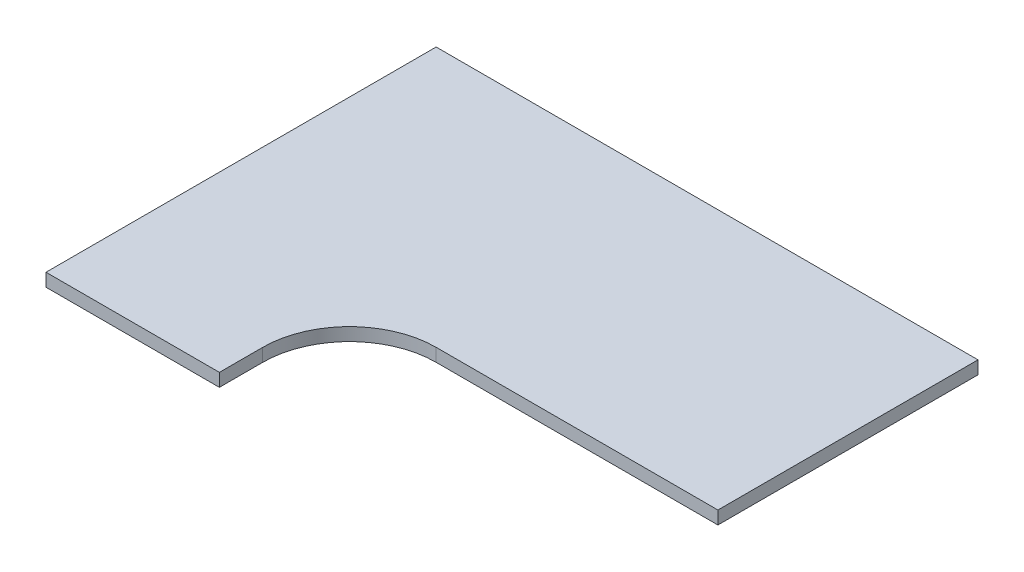
ISO-10303-21;
HEADER;
FILE_DESCRIPTION(('STEP AP214'),'2;1');
FILE_NAME('part.step','',(''),(''),'','','');
FILE_SCHEMA(('AUTOMOTIVE_DESIGN { 1 0 10303 214 1 1 1 1 }'));
ENDSEC;
DATA;
#1=APPLICATION_CONTEXT('core data for automotive mechanical design processes');
#2=APPLICATION_PROTOCOL_DEFINITION('international standard','automotive_design',2000,#1);
#3=PRODUCT_CONTEXT('',#1,'mechanical');
#4=PRODUCT('Part','Part','',(#3));
#5=PRODUCT_RELATED_PRODUCT_CATEGORY('part','',(#4));
#6=PRODUCT_DEFINITION_FORMATION('','',#4);
#7=PRODUCT_DEFINITION_CONTEXT('part definition',#1,'design');
#8=PRODUCT_DEFINITION('design','',#6,#7);
#9=PRODUCT_DEFINITION_SHAPE('','',#8);
#10=(LENGTH_UNIT() NAMED_UNIT(*) SI_UNIT(.MILLI.,.METRE.));
#11=(NAMED_UNIT(*) PLANE_ANGLE_UNIT() SI_UNIT($,.RADIAN.));
#12=(NAMED_UNIT(*) SI_UNIT($,.STERADIAN.) SOLID_ANGLE_UNIT());
#13=UNCERTAINTY_MEASURE_WITH_UNIT(LENGTH_MEASURE(1.E-05),#10,'distance_accuracy_value','');
#14=(GEOMETRIC_REPRESENTATION_CONTEXT(3) GLOBAL_UNCERTAINTY_ASSIGNED_CONTEXT((#13)) GLOBAL_UNIT_ASSIGNED_CONTEXT((#10,
#11,#12)) REPRESENTATION_CONTEXT('',''));
#15=CARTESIAN_POINT('',(0.,0.,0.));
#16=DIRECTION('',(0.,0.,1.));
#17=DIRECTION('',(1.,0.,0.));
#18=AXIS2_PLACEMENT_3D('',#15,#16,#17);
#19=CARTESIAN_POINT('',(0.,30.,0.));
#20=DIRECTION('',(0.,0.,1.));
#21=DIRECTION('',(1.,0.,0.));
#22=AXIS2_PLACEMENT_3D('',#19,#20,#21);
#23=PLANE('',#22);
#24=DIRECTION('',(-1.,0.,0.));
#25=VECTOR('',#24,1.);
#26=CARTESIAN_POINT('',(0.,0.,0.));
#27=LINE('',#26,#25);
#28=CARTESIAN_POINT('',(1250.,0.,0.));
#29=VERTEX_POINT('',#28);
#30=CARTESIAN_POINT('',(0.,0.,0.));
#31=VERTEX_POINT('',#30);
#32=EDGE_CURVE('E123',#29,#31,#27,.T.);
#33=ORIENTED_EDGE('',*,*,#32,.T.);
#34=DIRECTION('',(0.,-1.,0.));
#35=VECTOR('',#34,1.);
#36=CARTESIAN_POINT('',(0.,30.,0.));
#37=LINE('',#36,#35);
#38=CARTESIAN_POINT('',(0.,30.,0.));
#39=VERTEX_POINT('',#38);
#40=EDGE_CURVE('E11',#39,#31,#37,.T.);
#41=ORIENTED_EDGE('',*,*,#40,.F.);
#42=DIRECTION('',(-1.,0.,0.));
#43=VECTOR('',#42,1.);
#44=CARTESIAN_POINT('',(0.,30.,0.));
#45=LINE('',#44,#43);
#46=CARTESIAN_POINT('',(1250.,30.,0.));
#47=VERTEX_POINT('',#46);
#48=EDGE_CURVE('E135',#47,#39,#45,.T.);
#49=ORIENTED_EDGE('',*,*,#48,.F.);
#50=DIRECTION('',(0.,-1.,0.));
#51=VECTOR('',#50,1.);
#52=CARTESIAN_POINT('',(1250.,30.,0.));
#53=LINE('',#52,#51);
#54=EDGE_CURVE('E119',#47,#29,#53,.T.);
#55=ORIENTED_EDGE('',*,*,#54,.T.);
#56=EDGE_LOOP('',(#33,#41,#49,#55));
#57=FACE_BOUND('',#56,.T.);
#58=ADVANCED_FACE('F33',(#57),#23,.F.);
#59=CARTESIAN_POINT('',(0.,30.,0.));
#60=DIRECTION('',(1.,0.,0.));
#61=DIRECTION('',(0.,0.,-1.));
#62=AXIS2_PLACEMENT_3D('',#59,#60,#61);
#63=PLANE('',#62);
#64=DIRECTION('',(0.,0.,1.));
#65=VECTOR('',#64,1.);
#66=CARTESIAN_POINT('',(0.,0.,0.));
#67=LINE('',#66,#65);
#68=CARTESIAN_POINT('',(0.,0.,900.));
#69=VERTEX_POINT('',#68);
#70=EDGE_CURVE('E126',#31,#69,#67,.T.);
#71=ORIENTED_EDGE('',*,*,#70,.T.);
#72=DIRECTION('',(0.,-1.,0.));
#73=VECTOR('',#72,1.);
#74=CARTESIAN_POINT('',(0.,30.,900.));
#75=LINE('',#74,#73);
#76=CARTESIAN_POINT('',(0.,30.,900.));
#77=VERTEX_POINT('',#76);
#78=EDGE_CURVE('E41',#77,#69,#75,.T.);
#79=ORIENTED_EDGE('',*,*,#78,.F.);
#80=DIRECTION('',(0.,0.,1.));
#81=VECTOR('',#80,1.);
#82=CARTESIAN_POINT('',(0.,30.,0.));
#83=LINE('',#82,#81);
#84=EDGE_CURVE('E89',#39,#77,#83,.T.);
#85=ORIENTED_EDGE('',*,*,#84,.F.);
#86=ORIENTED_EDGE('',*,*,#40,.T.);
#87=EDGE_LOOP('',(#71,#79,#85,#86));
#88=FACE_BOUND('',#87,.T.);
#89=ADVANCED_FACE('F160',(#88),#63,.F.);
#90=CARTESIAN_POINT('',(400.,30.,900.));
#91=DIRECTION('',(0.,0.,-1.));
#92=DIRECTION('',(-1.,0.,0.));
#93=AXIS2_PLACEMENT_3D('',#90,#91,#92);
#94=PLANE('',#93);
#95=DIRECTION('',(1.,0.,0.));
#96=VECTOR('',#95,1.);
#97=CARTESIAN_POINT('',(400.,0.,900.));
#98=LINE('',#97,#96);
#99=CARTESIAN_POINT('',(400.,0.,900.));
#100=VERTEX_POINT('',#99);
#101=EDGE_CURVE('E128',#69,#100,#98,.T.);
#102=ORIENTED_EDGE('',*,*,#101,.T.);
#103=DIRECTION('',(0.,-1.,0.));
#104=VECTOR('',#103,1.);
#105=CARTESIAN_POINT('',(400.,30.,900.));
#106=LINE('',#105,#104);
#107=CARTESIAN_POINT('',(400.,30.,900.));
#108=VERTEX_POINT('',#107);
#109=EDGE_CURVE('E139',#108,#100,#106,.T.);
#110=ORIENTED_EDGE('',*,*,#109,.F.);
#111=DIRECTION('',(1.,0.,0.));
#112=VECTOR('',#111,1.);
#113=CARTESIAN_POINT('',(400.,30.,900.));
#114=LINE('',#113,#112);
#115=EDGE_CURVE('E147',#77,#108,#114,.T.);
#116=ORIENTED_EDGE('',*,*,#115,.F.);
#117=ORIENTED_EDGE('',*,*,#78,.T.);
#118=EDGE_LOOP('',(#102,#110,#116,#117));
#119=FACE_BOUND('',#118,.T.);
#120=ADVANCED_FACE('F145',(#119),#94,.F.);
#121=CARTESIAN_POINT('',(400.,30.,800.000000000001));
#122=DIRECTION('',(-1.,0.,0.));
#123=DIRECTION('',(0.,0.,1.));
#124=AXIS2_PLACEMENT_3D('',#121,#122,#123);
#125=PLANE('',#124);
#126=DIRECTION('',(0.,0.,-1.));
#127=VECTOR('',#126,1.);
#128=CARTESIAN_POINT('',(400.,0.,800.000000000001));
#129=LINE('',#128,#127);
#130=CARTESIAN_POINT('',(400.,0.,800.000000000001));
#131=VERTEX_POINT('',#130);
#132=EDGE_CURVE('E130',#100,#131,#129,.T.);
#133=ORIENTED_EDGE('',*,*,#132,.T.);
#134=DIRECTION('',(0.,-1.,0.));
#135=VECTOR('',#134,1.);
#136=CARTESIAN_POINT('',(400.,30.,800.000000000001));
#137=LINE('',#136,#135);
#138=CARTESIAN_POINT('',(400.,30.,800.000000000001));
#139=VERTEX_POINT('',#138);
#140=EDGE_CURVE('E114',#139,#131,#137,.T.);
#141=ORIENTED_EDGE('',*,*,#140,.F.);
#142=DIRECTION('',(0.,0.,-1.));
#143=VECTOR('',#142,1.);
#144=CARTESIAN_POINT('',(400.,30.,800.000000000001));
#145=LINE('',#144,#143);
#146=EDGE_CURVE('E105',#108,#139,#145,.T.);
#147=ORIENTED_EDGE('',*,*,#146,.F.);
#148=ORIENTED_EDGE('',*,*,#109,.T.);
#149=EDGE_LOOP('',(#133,#141,#147,#148));
#150=FACE_BOUND('',#149,.T.);
#151=ADVANCED_FACE('F153',(#150),#125,.F.);
#152=CARTESIAN_POINT('',(600.,30.,800.));
#153=DIRECTION('',(0.,-1.,0.));
#154=DIRECTION('',(0.,0.,-1.));
#155=AXIS2_PLACEMENT_3D('',#152,#153,#154);
#156=CYLINDRICAL_SURFACE('',#155,200.);
#157=CARTESIAN_POINT('',(600.,0.,800.));
#158=DIRECTION('',(0.,-1.,0.));
#159=DIRECTION('',(0.,0.,1.));
#160=AXIS2_PLACEMENT_3D('',#157,#158,#159);
#161=CIRCLE('',#160,200.);
#162=CARTESIAN_POINT('',(600.000000000001,0.,600.));
#163=VERTEX_POINT('',#162);
#164=EDGE_CURVE('E113',#131,#163,#161,.T.);
#165=ORIENTED_EDGE('',*,*,#164,.T.);
#166=DIRECTION('',(0.,-1.,0.));
#167=VECTOR('',#166,1.);
#168=CARTESIAN_POINT('',(600.000000000001,30.,600.));
#169=LINE('',#168,#167);
#170=CARTESIAN_POINT('',(600.000000000001,30.,600.));
#171=VERTEX_POINT('',#170);
#172=EDGE_CURVE('E110',#171,#163,#169,.T.);
#173=ORIENTED_EDGE('',*,*,#172,.F.);
#174=CARTESIAN_POINT('',(600.,30.,800.));
#175=DIRECTION('',(0.,-1.,0.));
#176=DIRECTION('',(0.,0.,1.));
#177=AXIS2_PLACEMENT_3D('',#174,#175,#176);
#178=CIRCLE('',#177,200.);
#179=EDGE_CURVE('E99',#139,#171,#178,.T.);
#180=ORIENTED_EDGE('',*,*,#179,.F.);
#181=ORIENTED_EDGE('',*,*,#140,.T.);
#182=EDGE_LOOP('',(#165,#173,#180,#181));
#183=FACE_BOUND('',#182,.T.);
#184=ADVANCED_FACE('F111',(#183),#156,.F.);
#185=CARTESIAN_POINT('',(1250.,30.,600.));
#186=DIRECTION('',(0.,0.,-1.));
#187=DIRECTION('',(-1.,0.,0.));
#188=AXIS2_PLACEMENT_3D('',#185,#186,#187);
#189=PLANE('',#188);
#190=DIRECTION('',(1.,0.,0.));
#191=VECTOR('',#190,1.);
#192=CARTESIAN_POINT('',(1250.,0.,600.));
#193=LINE('',#192,#191);
#194=CARTESIAN_POINT('',(1250.,0.,600.));
#195=VERTEX_POINT('',#194);
#196=EDGE_CURVE('E75',#163,#195,#193,.T.);
#197=ORIENTED_EDGE('',*,*,#196,.T.);
#198=DIRECTION('',(0.,-1.,0.));
#199=VECTOR('',#198,1.);
#200=CARTESIAN_POINT('',(1250.,30.,600.));
#201=LINE('',#200,#199);
#202=CARTESIAN_POINT('',(1250.,30.,600.));
#203=VERTEX_POINT('',#202);
#204=EDGE_CURVE('E115',#203,#195,#201,.T.);
#205=ORIENTED_EDGE('',*,*,#204,.F.);
#206=DIRECTION('',(1.,0.,0.));
#207=VECTOR('',#206,1.);
#208=CARTESIAN_POINT('',(1250.,30.,600.));
#209=LINE('',#208,#207);
#210=EDGE_CURVE('E103',#171,#203,#209,.T.);
#211=ORIENTED_EDGE('',*,*,#210,.F.);
#212=ORIENTED_EDGE('',*,*,#172,.T.);
#213=EDGE_LOOP('',(#197,#205,#211,#212));
#214=FACE_BOUND('',#213,.T.);
#215=ADVANCED_FACE('F117',(#214),#189,.F.);
#216=CARTESIAN_POINT('',(1250.,30.,0.));
#217=DIRECTION('',(-1.,0.,0.));
#218=DIRECTION('',(0.,0.,1.));
#219=AXIS2_PLACEMENT_3D('',#216,#217,#218);
#220=PLANE('',#219);
#221=DIRECTION('',(0.,0.,-1.));
#222=VECTOR('',#221,1.);
#223=CARTESIAN_POINT('',(1250.,0.,0.));
#224=LINE('',#223,#222);
#225=EDGE_CURVE('E81',#195,#29,#224,.T.);
#226=ORIENTED_EDGE('',*,*,#225,.T.);
#227=ORIENTED_EDGE('',*,*,#54,.F.);
#228=DIRECTION('',(0.,0.,-1.));
#229=VECTOR('',#228,1.);
#230=CARTESIAN_POINT('',(1250.,30.,0.));
#231=LINE('',#230,#229);
#232=EDGE_CURVE('E49',#203,#47,#231,.T.);
#233=ORIENTED_EDGE('',*,*,#232,.F.);
#234=ORIENTED_EDGE('',*,*,#204,.T.);
#235=EDGE_LOOP('',(#226,#227,#233,#234));
#236=FACE_BOUND('',#235,.T.);
#237=ADVANCED_FACE('F174',(#236),#220,.F.);
#238=CARTESIAN_POINT('',(600.,30.,800.));
#239=DIRECTION('',(0.,1.,0.));
#240=DIRECTION('',(0.,0.,1.));
#241=AXIS2_PLACEMENT_3D('',#238,#239,#240);
#242=PLANE('',#241);
#243=ORIENTED_EDGE('',*,*,#48,.T.);
#244=ORIENTED_EDGE('',*,*,#84,.T.);
#245=ORIENTED_EDGE('',*,*,#115,.T.);
#246=ORIENTED_EDGE('',*,*,#146,.T.);
#247=ORIENTED_EDGE('',*,*,#179,.T.);
#248=ORIENTED_EDGE('',*,*,#210,.T.);
#249=ORIENTED_EDGE('',*,*,#232,.T.);
#250=EDGE_LOOP('',(#243,#244,#245,#246,#247,#248,#249));
#251=FACE_BOUND('',#250,.T.);
#252=ADVANCED_FACE('F101',(#251),#242,.T.);
#253=CARTESIAN_POINT('',(600.,0.,800.));
#254=DIRECTION('',(0.,1.,0.));
#255=DIRECTION('',(0.,0.,1.));
#256=AXIS2_PLACEMENT_3D('',#253,#254,#255);
#257=PLANE('',#256);
#258=ORIENTED_EDGE('',*,*,#32,.F.);
#259=ORIENTED_EDGE('',*,*,#225,.F.);
#260=ORIENTED_EDGE('',*,*,#196,.F.);
#261=ORIENTED_EDGE('',*,*,#164,.F.);
#262=ORIENTED_EDGE('',*,*,#132,.F.);
#263=ORIENTED_EDGE('',*,*,#101,.F.);
#264=ORIENTED_EDGE('',*,*,#70,.F.);
#265=EDGE_LOOP('',(#258,#259,#260,#261,#262,#263,#264));
#266=FACE_BOUND('',#265,.T.);
#267=ADVANCED_FACE('F151',(#266),#257,.F.);
#268=CLOSED_SHELL('',(#58,#89,#120,#151,#184,#215,#237,#252,#267));
#269=MANIFOLD_SOLID_BREP('B2',#268);
#270=ADVANCED_BREP_SHAPE_REPRESENTATION('',(#18,#269),#14);
#271=SHAPE_DEFINITION_REPRESENTATION(#9,#270);
ENDSEC;
END-ISO-10303-21;
